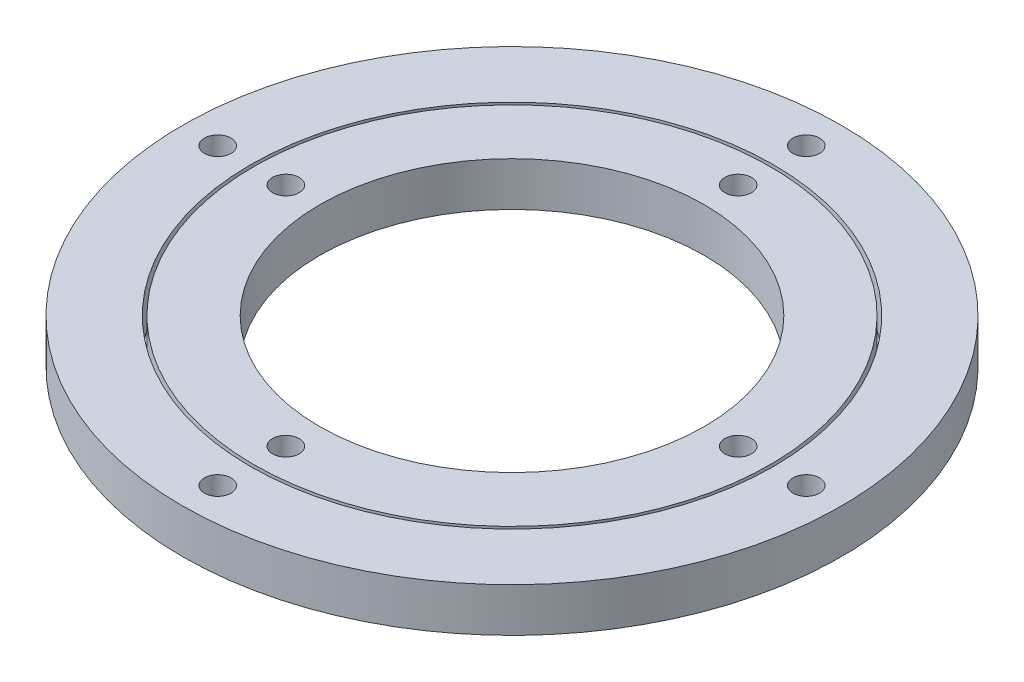
ISO-10303-21;
HEADER;
FILE_DESCRIPTION(('STEP AP214'),'2;1');
FILE_NAME('part.step','',(''),(''),'','','');
FILE_SCHEMA(('AUTOMOTIVE_DESIGN { 1 0 10303 214 1 1 1 1 }'));
ENDSEC;
DATA;
#1=APPLICATION_CONTEXT('core data for automotive mechanical design processes');
#2=APPLICATION_PROTOCOL_DEFINITION('international standard','automotive_design',2000,#1);
#3=PRODUCT_CONTEXT('',#1,'mechanical');
#4=PRODUCT('Part','Part','',(#3));
#5=PRODUCT_RELATED_PRODUCT_CATEGORY('part','',(#4));
#6=PRODUCT_DEFINITION_FORMATION('','',#4);
#7=PRODUCT_DEFINITION_CONTEXT('part definition',#1,'design');
#8=PRODUCT_DEFINITION('design','',#6,#7);
#9=PRODUCT_DEFINITION_SHAPE('','',#8);
#10=(LENGTH_UNIT() NAMED_UNIT(*) SI_UNIT(.MILLI.,.METRE.));
#11=(NAMED_UNIT(*) PLANE_ANGLE_UNIT() SI_UNIT($,.RADIAN.));
#12=(NAMED_UNIT(*) SI_UNIT($,.STERADIAN.) SOLID_ANGLE_UNIT());
#13=UNCERTAINTY_MEASURE_WITH_UNIT(LENGTH_MEASURE(1.E-05),#10,'distance_accuracy_value','');
#14=(GEOMETRIC_REPRESENTATION_CONTEXT(3) GLOBAL_UNCERTAINTY_ASSIGNED_CONTEXT((#13)) GLOBAL_UNIT_ASSIGNED_CONTEXT((#10,
#11,#12)) REPRESENTATION_CONTEXT('',''));
#15=CARTESIAN_POINT('',(0.,0.,0.));
#16=DIRECTION('',(0.,0.,1.));
#17=DIRECTION('',(1.,0.,0.));
#18=AXIS2_PLACEMENT_3D('',#15,#16,#17);
#19=CARTESIAN_POINT('',(0.,8.,0.));
#20=DIRECTION('',(0.,1.,0.));
#21=DIRECTION('',(0.,0.,1.));
#22=AXIS2_PLACEMENT_3D('',#19,#20,#21);
#23=PLANE('',#22);
#24=CARTESIAN_POINT('',(-41.175,8.,0.));
#25=DIRECTION('',(0.,1.,0.));
#26=DIRECTION('',(0.,0.,1.));
#27=AXIS2_PLACEMENT_3D('',#24,#25,#26);
#28=CIRCLE('',#27,2.425);
#29=CARTESIAN_POINT('',(-41.175,8.,2.425));
#30=VERTEX_POINT('',#29);
#31=EDGE_CURVE('E106',#30,#30,#28,.T.);
#32=ORIENTED_EDGE('',*,*,#31,.F.);
#33=EDGE_LOOP('',(#32));
#34=FACE_BOUND('',#33,.T.);
#35=CARTESIAN_POINT('',(1.43761744126866E-13,8.,-41.175));
#36=DIRECTION('',(0.,1.,0.));
#37=DIRECTION('',(0.,0.,1.));
#38=AXIS2_PLACEMENT_3D('',#35,#36,#37);
#39=CIRCLE('',#38,2.425);
#40=CARTESIAN_POINT('',(1.43761744126866E-13,8.,-38.75));
#41=VERTEX_POINT('',#40);
#42=EDGE_CURVE('E98',#41,#41,#39,.T.);
#43=ORIENTED_EDGE('',*,*,#42,.F.);
#44=EDGE_LOOP('',(#43));
#45=FACE_BOUND('',#44,.T.);
#46=CARTESIAN_POINT('',(41.175,8.,2.87523488253732E-13));
#47=DIRECTION('',(0.,1.,0.));
#48=DIRECTION('',(0.,0.,1.));
#49=AXIS2_PLACEMENT_3D('',#46,#47,#48);
#50=CIRCLE('',#49,2.425);
#51=CARTESIAN_POINT('',(41.175,8.,2.42500000000029));
#52=VERTEX_POINT('',#51);
#53=EDGE_CURVE('E90',#52,#52,#50,.T.);
#54=ORIENTED_EDGE('',*,*,#53,.F.);
#55=EDGE_LOOP('',(#54));
#56=FACE_BOUND('',#55,.T.);
#57=CARTESIAN_POINT('',(-4.31285232380598E-13,8.,41.175));
#58=DIRECTION('',(0.,1.,0.));
#59=DIRECTION('',(0.,0.,1.));
#60=AXIS2_PLACEMENT_3D('',#57,#58,#59);
#61=CIRCLE('',#60,2.425);
#62=CARTESIAN_POINT('',(-4.31285232380598E-13,8.,43.6));
#63=VERTEX_POINT('',#62);
#64=EDGE_CURVE('E81',#63,#63,#61,.T.);
#65=ORIENTED_EDGE('',*,*,#64,.F.);
#66=EDGE_LOOP('',(#65));
#67=FACE_BOUND('',#66,.T.);
#68=CARTESIAN_POINT('',(0.,8.,0.));
#69=DIRECTION('',(0.,1.,0.));
#70=DIRECTION('',(0.,0.,1.));
#71=AXIS2_PLACEMENT_3D('',#68,#69,#70);
#72=CIRCLE('',#71,35.);
#73=CARTESIAN_POINT('',(0.,8.,35.));
#74=VERTEX_POINT('',#73);
#75=EDGE_CURVE('E55',#74,#74,#72,.T.);
#76=ORIENTED_EDGE('',*,*,#75,.F.);
#77=EDGE_LOOP('',(#76));
#78=FACE_BOUND('',#77,.T.);
#79=CARTESIAN_POINT('',(0.,8.,0.));
#80=DIRECTION('',(0.,1.,0.));
#81=DIRECTION('',(0.,0.,1.));
#82=AXIS2_PLACEMENT_3D('',#79,#80,#81);
#83=CIRCLE('',#82,47.);
#84=CARTESIAN_POINT('',(0.,8.,47.));
#85=VERTEX_POINT('',#84);
#86=EDGE_CURVE('E73',#85,#85,#83,.T.);
#87=ORIENTED_EDGE('',*,*,#86,.T.);
#88=EDGE_LOOP('',(#87));
#89=FACE_BOUND('',#88,.T.);
#90=ADVANCED_FACE('F42',(#34,#45,#56,#67,#78,#89),#23,.T.);
#91=CARTESIAN_POINT('',(1.8632438626603E-13,8.,-53.575));
#92=DIRECTION('',(0.,1.,0.));
#93=DIRECTION('',(0.,0.,1.));
#94=AXIS2_PLACEMENT_3D('',#91,#92,#93);
#95=CIRCLE('',#94,2.425);
#96=CARTESIAN_POINT('',(1.8632438626603E-13,8.,-51.15));
#97=VERTEX_POINT('',#96);
#98=EDGE_CURVE('E137',#97,#97,#95,.T.);
#99=ORIENTED_EDGE('',*,*,#98,.F.);
#100=EDGE_LOOP('',(#99));
#101=FACE_BOUND('',#100,.T.);
#102=CARTESIAN_POINT('',(53.575,8.,3.73380498994551E-13));
#103=DIRECTION('',(0.,1.,0.));
#104=DIRECTION('',(0.,0.,1.));
#105=AXIS2_PLACEMENT_3D('',#102,#103,#104);
#106=CIRCLE('',#105,2.425);
#107=CARTESIAN_POINT('',(53.575,8.,2.42500000000037));
#108=VERTEX_POINT('',#107);
#109=EDGE_CURVE('E129',#108,#108,#106,.T.);
#110=ORIENTED_EDGE('',*,*,#109,.F.);
#111=EDGE_LOOP('',(#110));
#112=FACE_BOUND('',#111,.T.);
#113=CARTESIAN_POINT('',(-5.60436611723072E-13,8.,53.575));
#114=DIRECTION('',(0.,1.,0.));
#115=DIRECTION('',(0.,0.,1.));
#116=AXIS2_PLACEMENT_3D('',#113,#114,#115);
#117=CIRCLE('',#116,2.425);
#118=CARTESIAN_POINT('',(-5.60436611723072E-13,8.,56.));
#119=VERTEX_POINT('',#118);
#120=EDGE_CURVE('E121',#119,#119,#117,.T.);
#121=ORIENTED_EDGE('',*,*,#120,.F.);
#122=EDGE_LOOP('',(#121));
#123=FACE_BOUND('',#122,.T.);
#124=CARTESIAN_POINT('',(-53.575,8.,0.));
#125=DIRECTION('',(0.,1.,0.));
#126=DIRECTION('',(0.,0.,1.));
#127=AXIS2_PLACEMENT_3D('',#124,#125,#126);
#128=CIRCLE('',#127,2.425);
#129=CARTESIAN_POINT('',(-53.575,8.,2.425));
#130=VERTEX_POINT('',#129);
#131=EDGE_CURVE('E113',#130,#130,#128,.T.);
#132=ORIENTED_EDGE('',*,*,#131,.F.);
#133=EDGE_LOOP('',(#132));
#134=FACE_BOUND('',#133,.T.);
#135=CARTESIAN_POINT('',(0.,8.,0.));
#136=DIRECTION('',(0.,1.,0.));
#137=DIRECTION('',(0.,0.,1.));
#138=AXIS2_PLACEMENT_3D('',#135,#136,#137);
#139=CIRCLE('',#138,47.6);
#140=CARTESIAN_POINT('',(0.,8.,47.6));
#141=VERTEX_POINT('',#140);
#142=EDGE_CURVE('E68',#141,#141,#139,.T.);
#143=ORIENTED_EDGE('',*,*,#142,.F.);
#144=EDGE_LOOP('',(#143));
#145=FACE_BOUND('',#144,.T.);
#146=CARTESIAN_POINT('',(0.,8.,0.));
#147=DIRECTION('',(0.,1.,0.));
#148=DIRECTION('',(0.,0.,1.));
#149=AXIS2_PLACEMENT_3D('',#146,#147,#148);
#150=CIRCLE('',#149,60.);
#151=CARTESIAN_POINT('',(0.,8.,60.));
#152=VERTEX_POINT('',#151);
#153=EDGE_CURVE('E11',#152,#152,#150,.T.);
#154=ORIENTED_EDGE('',*,*,#153,.T.);
#155=EDGE_LOOP('',(#154));
#156=FACE_BOUND('',#155,.T.);
#157=ADVANCED_FACE('F155',(#101,#112,#123,#134,#145,#156),#23,.T.);
#158=CARTESIAN_POINT('',(0.,0.,0.));
#159=DIRECTION('',(0.,1.,0.));
#160=DIRECTION('',(0.,0.,1.));
#161=AXIS2_PLACEMENT_3D('',#158,#159,#160);
#162=PLANE('',#161);
#163=CARTESIAN_POINT('',(1.8632438626603E-13,0.,-53.575));
#164=DIRECTION('',(0.,1.,0.));
#165=DIRECTION('',(0.,0.,1.));
#166=AXIS2_PLACEMENT_3D('',#163,#164,#165);
#167=CIRCLE('',#166,2.425);
#168=CARTESIAN_POINT('',(1.8632438626603E-13,0.,-51.15));
#169=VERTEX_POINT('',#168);
#170=EDGE_CURVE('E86',#169,#169,#167,.T.);
#171=ORIENTED_EDGE('',*,*,#170,.T.);
#172=EDGE_LOOP('',(#171));
#173=FACE_BOUND('',#172,.T.);
#174=CARTESIAN_POINT('',(53.575,0.,3.73380498994551E-13));
#175=DIRECTION('',(0.,1.,0.));
#176=DIRECTION('',(0.,0.,1.));
#177=AXIS2_PLACEMENT_3D('',#174,#175,#176);
#178=CIRCLE('',#177,2.425);
#179=CARTESIAN_POINT('',(53.575,0.,2.42500000000037));
#180=VERTEX_POINT('',#179);
#181=EDGE_CURVE('E133',#180,#180,#178,.T.);
#182=ORIENTED_EDGE('',*,*,#181,.T.);
#183=EDGE_LOOP('',(#182));
#184=FACE_BOUND('',#183,.T.);
#185=CARTESIAN_POINT('',(-5.60436611723072E-13,0.,53.575));
#186=DIRECTION('',(0.,1.,0.));
#187=DIRECTION('',(0.,0.,1.));
#188=AXIS2_PLACEMENT_3D('',#185,#186,#187);
#189=CIRCLE('',#188,2.425);
#190=CARTESIAN_POINT('',(-5.60436611723072E-13,0.,56.));
#191=VERTEX_POINT('',#190);
#192=EDGE_CURVE('E125',#191,#191,#189,.T.);
#193=ORIENTED_EDGE('',*,*,#192,.T.);
#194=EDGE_LOOP('',(#193));
#195=FACE_BOUND('',#194,.T.);
#196=CARTESIAN_POINT('',(-53.575,0.,0.));
#197=DIRECTION('',(0.,1.,0.));
#198=DIRECTION('',(0.,0.,1.));
#199=AXIS2_PLACEMENT_3D('',#196,#197,#198);
#200=CIRCLE('',#199,2.425);
#201=CARTESIAN_POINT('',(-53.575,0.,2.425));
#202=VERTEX_POINT('',#201);
#203=EDGE_CURVE('E117',#202,#202,#200,.T.);
#204=ORIENTED_EDGE('',*,*,#203,.T.);
#205=EDGE_LOOP('',(#204));
#206=FACE_BOUND('',#205,.T.);
#207=CARTESIAN_POINT('',(-41.175,0.,0.));
#208=DIRECTION('',(0.,1.,0.));
#209=DIRECTION('',(0.,0.,1.));
#210=AXIS2_PLACEMENT_3D('',#207,#208,#209);
#211=CIRCLE('',#210,2.425);
#212=CARTESIAN_POINT('',(-41.175,0.,2.425));
#213=VERTEX_POINT('',#212);
#214=EDGE_CURVE('E74',#213,#213,#211,.T.);
#215=ORIENTED_EDGE('',*,*,#214,.T.);
#216=EDGE_LOOP('',(#215));
#217=FACE_BOUND('',#216,.T.);
#218=CARTESIAN_POINT('',(1.43761744126866E-13,0.,-41.175));
#219=DIRECTION('',(0.,1.,0.));
#220=DIRECTION('',(0.,0.,1.));
#221=AXIS2_PLACEMENT_3D('',#218,#219,#220);
#222=CIRCLE('',#221,2.425);
#223=CARTESIAN_POINT('',(1.43761744126866E-13,0.,-38.75));
#224=VERTEX_POINT('',#223);
#225=EDGE_CURVE('E102',#224,#224,#222,.T.);
#226=ORIENTED_EDGE('',*,*,#225,.T.);
#227=EDGE_LOOP('',(#226));
#228=FACE_BOUND('',#227,.T.);
#229=CARTESIAN_POINT('',(41.175,0.,2.87523488253732E-13));
#230=DIRECTION('',(0.,1.,0.));
#231=DIRECTION('',(0.,0.,1.));
#232=AXIS2_PLACEMENT_3D('',#229,#230,#231);
#233=CIRCLE('',#232,2.425);
#234=CARTESIAN_POINT('',(41.175,0.,2.42500000000029));
#235=VERTEX_POINT('',#234);
#236=EDGE_CURVE('E94',#235,#235,#233,.T.);
#237=ORIENTED_EDGE('',*,*,#236,.T.);
#238=EDGE_LOOP('',(#237));
#239=FACE_BOUND('',#238,.T.);
#240=CARTESIAN_POINT('',(-4.31285232380598E-13,0.,41.175));
#241=DIRECTION('',(0.,1.,0.));
#242=DIRECTION('',(0.,0.,1.));
#243=AXIS2_PLACEMENT_3D('',#240,#241,#242);
#244=CIRCLE('',#243,2.425);
#245=CARTESIAN_POINT('',(-4.31285232380598E-13,0.,43.6));
#246=VERTEX_POINT('',#245);
#247=EDGE_CURVE('E85',#246,#246,#244,.T.);
#248=ORIENTED_EDGE('',*,*,#247,.T.);
#249=EDGE_LOOP('',(#248));
#250=FACE_BOUND('',#249,.T.);
#251=CARTESIAN_POINT('',(0.,0.,0.));
#252=DIRECTION('',(0.,1.,0.));
#253=DIRECTION('',(0.,0.,1.));
#254=AXIS2_PLACEMENT_3D('',#251,#252,#253);
#255=CIRCLE('',#254,60.);
#256=CARTESIAN_POINT('',(0.,0.,60.));
#257=VERTEX_POINT('',#256);
#258=EDGE_CURVE('E46',#257,#257,#255,.T.);
#259=ORIENTED_EDGE('',*,*,#258,.F.);
#260=EDGE_LOOP('',(#259));
#261=FACE_BOUND('',#260,.T.);
#262=CARTESIAN_POINT('',(0.,0.,0.));
#263=DIRECTION('',(0.,1.,0.));
#264=DIRECTION('',(0.,0.,1.));
#265=AXIS2_PLACEMENT_3D('',#262,#263,#264);
#266=CIRCLE('',#265,35.);
#267=CARTESIAN_POINT('',(0.,0.,35.));
#268=VERTEX_POINT('',#267);
#269=EDGE_CURVE('E57',#268,#268,#266,.T.);
#270=ORIENTED_EDGE('',*,*,#269,.T.);
#271=EDGE_LOOP('',(#270));
#272=FACE_BOUND('',#271,.T.);
#273=ADVANCED_FACE('F145',(#173,#184,#195,#206,#217,#228,#239,#250,#261,#272),#162,.F.);
#274=CARTESIAN_POINT('',(0.,8.,0.));
#275=DIRECTION('',(0.,-1.,0.));
#276=DIRECTION('',(0.,0.,-1.));
#277=AXIS2_PLACEMENT_3D('',#274,#275,#276);
#278=CYLINDRICAL_SURFACE('',#277,60.);
#279=ORIENTED_EDGE('',*,*,#153,.F.);
#280=EDGE_LOOP('',(#279));
#281=FACE_BOUND('',#280,.T.);
#282=ORIENTED_EDGE('',*,*,#258,.T.);
#283=EDGE_LOOP('',(#282));
#284=FACE_BOUND('',#283,.T.);
#285=ADVANCED_FACE('F44',(#281,#284),#278,.T.);
#286=CARTESIAN_POINT('',(0.,8.,0.));
#287=DIRECTION('',(0.,-1.,0.));
#288=DIRECTION('',(0.,0.,-1.));
#289=AXIS2_PLACEMENT_3D('',#286,#287,#288);
#290=CYLINDRICAL_SURFACE('',#289,35.);
#291=ORIENTED_EDGE('',*,*,#75,.T.);
#292=EDGE_LOOP('',(#291));
#293=FACE_BOUND('',#292,.T.);
#294=ORIENTED_EDGE('',*,*,#269,.F.);
#295=EDGE_LOOP('',(#294));
#296=FACE_BOUND('',#295,.T.);
#297=ADVANCED_FACE('F180',(#293,#296),#290,.F.);
#298=CARTESIAN_POINT('',(0.,-134.633131137919,0.));
#299=DIRECTION('',(0.,1.,0.));
#300=DIRECTION('',(0.,0.,1.));
#301=AXIS2_PLACEMENT_3D('',#298,#299,#300);
#302=CYLINDRICAL_SURFACE('',#301,47.);
#303=CARTESIAN_POINT('',(0.,0.5,0.));
#304=DIRECTION('',(0.,1.,0.));
#305=DIRECTION('',(0.,0.,1.));
#306=AXIS2_PLACEMENT_3D('',#303,#304,#305);
#307=CIRCLE('',#306,47.);
#308=CARTESIAN_POINT('',(0.,0.5,47.));
#309=VERTEX_POINT('',#308);
#310=EDGE_CURVE('E69',#309,#309,#307,.F.);
#311=ORIENTED_EDGE('',*,*,#310,.F.);
#312=EDGE_LOOP('',(#311));
#313=FACE_BOUND('',#312,.T.);
#314=ORIENTED_EDGE('',*,*,#86,.F.);
#315=EDGE_LOOP('',(#314));
#316=FACE_BOUND('',#315,.T.);
#317=ADVANCED_FACE('F170',(#313,#316),#302,.T.);
#318=CARTESIAN_POINT('',(0.,-134.633131137919,0.));
#319=DIRECTION('',(0.,1.,0.));
#320=DIRECTION('',(0.,0.,1.));
#321=AXIS2_PLACEMENT_3D('',#318,#319,#320);
#322=CYLINDRICAL_SURFACE('',#321,47.6);
#323=CARTESIAN_POINT('',(0.,0.5,0.));
#324=DIRECTION('',(0.,1.,0.));
#325=DIRECTION('',(0.,0.,1.));
#326=AXIS2_PLACEMENT_3D('',#323,#324,#325);
#327=CIRCLE('',#326,47.6);
#328=CARTESIAN_POINT('',(0.,0.5,47.6));
#329=VERTEX_POINT('',#328);
#330=EDGE_CURVE('E61',#329,#329,#327,.F.);
#331=ORIENTED_EDGE('',*,*,#330,.T.);
#332=EDGE_LOOP('',(#331));
#333=FACE_BOUND('',#332,.T.);
#334=ORIENTED_EDGE('',*,*,#142,.T.);
#335=EDGE_LOOP('',(#334));
#336=FACE_BOUND('',#335,.T.);
#337=ADVANCED_FACE('F167',(#333,#336),#322,.F.);
#338=CARTESIAN_POINT('',(0.,0.5,0.));
#339=DIRECTION('',(0.,1.,0.));
#340=DIRECTION('',(0.,0.,1.));
#341=AXIS2_PLACEMENT_3D('',#338,#339,#340);
#342=PLANE('',#341);
#343=ORIENTED_EDGE('',*,*,#330,.F.);
#344=EDGE_LOOP('',(#343));
#345=FACE_BOUND('',#344,.T.);
#346=ORIENTED_EDGE('',*,*,#310,.T.);
#347=EDGE_LOOP('',(#346));
#348=FACE_BOUND('',#347,.T.);
#349=ADVANCED_FACE('F169',(#345,#348),#342,.T.);
#350=CARTESIAN_POINT('',(-4.31285232380598E-13,0.,41.175));
#351=DIRECTION('',(0.,1.,0.));
#352=DIRECTION('',(0.,0.,1.));
#353=AXIS2_PLACEMENT_3D('',#350,#351,#352);
#354=CYLINDRICAL_SURFACE('',#353,2.425);
#355=ORIENTED_EDGE('',*,*,#247,.F.);
#356=EDGE_LOOP('',(#355));
#357=FACE_BOUND('',#356,.T.);
#358=ORIENTED_EDGE('',*,*,#64,.T.);
#359=EDGE_LOOP('',(#358));
#360=FACE_BOUND('',#359,.T.);
#361=ADVANCED_FACE('F177',(#357,#360),#354,.F.);
#362=CARTESIAN_POINT('',(41.175,0.,2.87523488253732E-13));
#363=DIRECTION('',(0.,1.,0.));
#364=DIRECTION('',(0.,0.,1.));
#365=AXIS2_PLACEMENT_3D('',#362,#363,#364);
#366=CYLINDRICAL_SURFACE('',#365,2.425);
#367=ORIENTED_EDGE('',*,*,#236,.F.);
#368=EDGE_LOOP('',(#367));
#369=FACE_BOUND('',#368,.T.);
#370=ORIENTED_EDGE('',*,*,#53,.T.);
#371=EDGE_LOOP('',(#370));
#372=FACE_BOUND('',#371,.T.);
#373=ADVANCED_FACE('F244',(#369,#372),#366,.F.);
#374=CARTESIAN_POINT('',(1.43761744126866E-13,0.,-41.175));
#375=DIRECTION('',(0.,1.,0.));
#376=DIRECTION('',(0.,0.,1.));
#377=AXIS2_PLACEMENT_3D('',#374,#375,#376);
#378=CYLINDRICAL_SURFACE('',#377,2.425);
#379=ORIENTED_EDGE('',*,*,#225,.F.);
#380=EDGE_LOOP('',(#379));
#381=FACE_BOUND('',#380,.T.);
#382=ORIENTED_EDGE('',*,*,#42,.T.);
#383=EDGE_LOOP('',(#382));
#384=FACE_BOUND('',#383,.T.);
#385=ADVANCED_FACE('F251',(#381,#384),#378,.F.);
#386=CARTESIAN_POINT('',(-41.175,0.,0.));
#387=DIRECTION('',(0.,1.,0.));
#388=DIRECTION('',(0.,0.,1.));
#389=AXIS2_PLACEMENT_3D('',#386,#387,#388);
#390=CYLINDRICAL_SURFACE('',#389,2.425);
#391=ORIENTED_EDGE('',*,*,#214,.F.);
#392=EDGE_LOOP('',(#391));
#393=FACE_BOUND('',#392,.T.);
#394=ORIENTED_EDGE('',*,*,#31,.T.);
#395=EDGE_LOOP('',(#394));
#396=FACE_BOUND('',#395,.T.);
#397=ADVANCED_FACE('F259',(#393,#396),#390,.F.);
#398=CARTESIAN_POINT('',(-53.575,0.,0.));
#399=DIRECTION('',(0.,1.,0.));
#400=DIRECTION('',(0.,0.,1.));
#401=AXIS2_PLACEMENT_3D('',#398,#399,#400);
#402=CYLINDRICAL_SURFACE('',#401,2.425);
#403=ORIENTED_EDGE('',*,*,#203,.F.);
#404=EDGE_LOOP('',(#403));
#405=FACE_BOUND('',#404,.T.);
#406=ORIENTED_EDGE('',*,*,#131,.T.);
#407=EDGE_LOOP('',(#406));
#408=FACE_BOUND('',#407,.T.);
#409=ADVANCED_FACE('F267',(#405,#408),#402,.F.);
#410=CARTESIAN_POINT('',(-5.60436611723072E-13,0.,53.575));
#411=DIRECTION('',(0.,1.,0.));
#412=DIRECTION('',(0.,0.,1.));
#413=AXIS2_PLACEMENT_3D('',#410,#411,#412);
#414=CYLINDRICAL_SURFACE('',#413,2.425);
#415=ORIENTED_EDGE('',*,*,#192,.F.);
#416=EDGE_LOOP('',(#415));
#417=FACE_BOUND('',#416,.T.);
#418=ORIENTED_EDGE('',*,*,#120,.T.);
#419=EDGE_LOOP('',(#418));
#420=FACE_BOUND('',#419,.T.);
#421=ADVANCED_FACE('F274',(#417,#420),#414,.F.);
#422=CARTESIAN_POINT('',(53.575,0.,3.73380498994551E-13));
#423=DIRECTION('',(0.,1.,0.));
#424=DIRECTION('',(0.,0.,1.));
#425=AXIS2_PLACEMENT_3D('',#422,#423,#424);
#426=CYLINDRICAL_SURFACE('',#425,2.425);
#427=ORIENTED_EDGE('',*,*,#181,.F.);
#428=EDGE_LOOP('',(#427));
#429=FACE_BOUND('',#428,.T.);
#430=ORIENTED_EDGE('',*,*,#109,.T.);
#431=EDGE_LOOP('',(#430));
#432=FACE_BOUND('',#431,.T.);
#433=ADVANCED_FACE('F151',(#429,#432),#426,.F.);
#434=CARTESIAN_POINT('',(1.8632438626603E-13,0.,-53.575));
#435=DIRECTION('',(0.,1.,0.));
#436=DIRECTION('',(0.,0.,1.));
#437=AXIS2_PLACEMENT_3D('',#434,#435,#436);
#438=CYLINDRICAL_SURFACE('',#437,2.425);
#439=ORIENTED_EDGE('',*,*,#170,.F.);
#440=EDGE_LOOP('',(#439));
#441=FACE_BOUND('',#440,.T.);
#442=ORIENTED_EDGE('',*,*,#98,.T.);
#443=EDGE_LOOP('',(#442));
#444=FACE_BOUND('',#443,.T.);
#445=ADVANCED_FACE('F148',(#441,#444),#438,.F.);
#446=CLOSED_SHELL('',(#90,#157,#273,#285,#297,#317,#337,#349,#361,#373,#385,#397,#409,#421,#433,#445));
#447=MANIFOLD_SOLID_BREP('B2',#446);
#448=ADVANCED_BREP_SHAPE_REPRESENTATION('',(#18,#447),#14);
#449=SHAPE_DEFINITION_REPRESENTATION(#9,#448);
ENDSEC;
END-ISO-10303-21;
